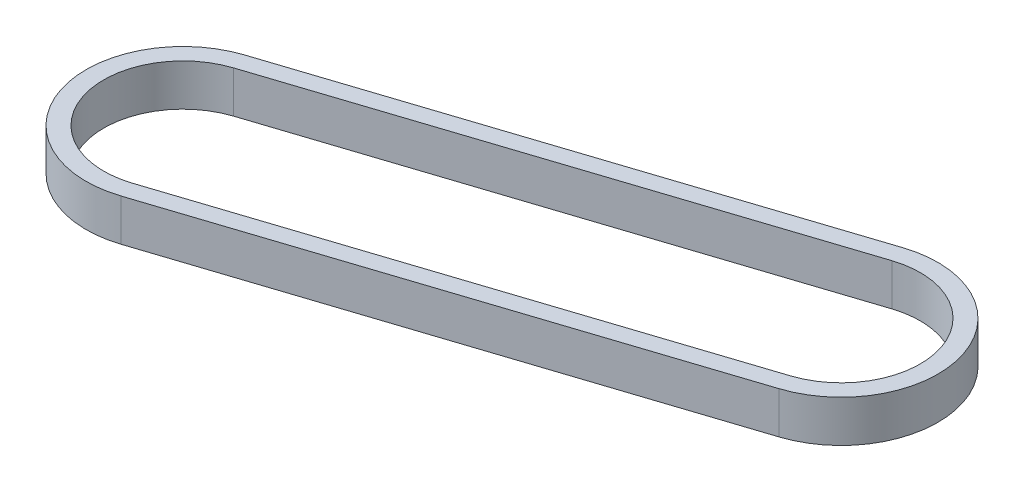
ISO-10303-21;
HEADER;
FILE_DESCRIPTION(('STEP AP214'),'2;1');
FILE_NAME('part.step','',(''),(''),'','','');
FILE_SCHEMA(('AUTOMOTIVE_DESIGN { 1 0 10303 214 1 1 1 1 }'));
ENDSEC;
DATA;
#1=APPLICATION_CONTEXT('core data for automotive mechanical design processes');
#2=APPLICATION_PROTOCOL_DEFINITION('international standard','automotive_design',2000,#1);
#3=PRODUCT_CONTEXT('',#1,'mechanical');
#4=PRODUCT('Part','Part','',(#3));
#5=PRODUCT_RELATED_PRODUCT_CATEGORY('part','',(#4));
#6=PRODUCT_DEFINITION_FORMATION('','',#4);
#7=PRODUCT_DEFINITION_CONTEXT('part definition',#1,'design');
#8=PRODUCT_DEFINITION('design','',#6,#7);
#9=PRODUCT_DEFINITION_SHAPE('','',#8);
#10=(LENGTH_UNIT() NAMED_UNIT(*) SI_UNIT(.MILLI.,.METRE.));
#11=(NAMED_UNIT(*) PLANE_ANGLE_UNIT() SI_UNIT($,.RADIAN.));
#12=(NAMED_UNIT(*) SI_UNIT($,.STERADIAN.) SOLID_ANGLE_UNIT());
#13=UNCERTAINTY_MEASURE_WITH_UNIT(LENGTH_MEASURE(1.E-05),#10,'distance_accuracy_value','');
#14=(GEOMETRIC_REPRESENTATION_CONTEXT(3) GLOBAL_UNCERTAINTY_ASSIGNED_CONTEXT((#13)) GLOBAL_UNIT_ASSIGNED_CONTEXT((#10,
#11,#12)) REPRESENTATION_CONTEXT('',''));
#15=CARTESIAN_POINT('',(0.,0.,0.));
#16=DIRECTION('',(0.,0.,1.));
#17=DIRECTION('',(1.,0.,0.));
#18=AXIS2_PLACEMENT_3D('',#15,#16,#17);
#19=CARTESIAN_POINT('',(-120.65,4.5,220.283627107511));
#20=DIRECTION('',(0.,1.,0.));
#21=DIRECTION('',(0.,0.,1.));
#22=AXIS2_PLACEMENT_3D('',#19,#20,#21);
#23=PLANE('',#22);
#24=CARTESIAN_POINT('',(-120.65,4.5,220.283627107511));
#25=DIRECTION('',(0.,1.,0.));
#26=DIRECTION('',(0.,0.,1.));
#27=AXIS2_PLACEMENT_3D('',#24,#25,#26);
#28=CIRCLE('',#27,20.8385928119739);
#29=CARTESIAN_POINT('',(-114.172884766972,4.5,240.090038408939));
#30=VERTEX_POINT('',#29);
#31=CARTESIAN_POINT('',(-127.127115233028,4.5,200.477215806083));
#32=VERTEX_POINT('',#31);
#33=EDGE_CURVE('E140',#30,#32,#28,.T.);
#34=ORIENTED_EDGE('',*,*,#33,.T.);
#35=DIRECTION('',(-0.950467792146074,0.,0.310823062356976));
#36=VECTOR('',#35,1.);
#37=CARTESIAN_POINT('',(-127.127115233028,4.5,200.477215806083));
#38=LINE('',#37,#36);
#39=CARTESIAN_POINT('',(-233.924491814363,4.5,235.402215806084));
#40=VERTEX_POINT('',#39);
#41=EDGE_CURVE('E143',#32,#40,#38,.T.);
#42=ORIENTED_EDGE('',*,*,#41,.T.);
#43=CARTESIAN_POINT('',(-227.447376581335,4.5,255.208627107511));
#44=DIRECTION('',(0.,1.,0.));
#45=DIRECTION('',(0.,0.,1.));
#46=AXIS2_PLACEMENT_3D('',#43,#44,#45);
#47=CIRCLE('',#46,20.8385928119739);
#48=CARTESIAN_POINT('',(-220.970261348307,4.5,275.015038408939));
#49=VERTEX_POINT('',#48);
#50=EDGE_CURVE('E146',#40,#49,#47,.T.);
#51=ORIENTED_EDGE('',*,*,#50,.T.);
#52=DIRECTION('',(0.950467792146073,0.,-0.310823062356976));
#53=VECTOR('',#52,1.);
#54=CARTESIAN_POINT('',(-114.172884766972,4.5,240.090038408939));
#55=LINE('',#54,#53);
#56=EDGE_CURVE('E148',#49,#30,#55,.T.);
#57=ORIENTED_EDGE('',*,*,#56,.T.);
#58=EDGE_LOOP('',(#34,#42,#51,#57));
#59=FACE_BOUND('',#58,.T.);
#60=DIRECTION('',(-0.950467792146074,0.,0.310823062356976));
#61=VECTOR('',#60,1.);
#62=CARTESIAN_POINT('',(-125.945987596071,4.5,204.088993416238));
#63=LINE('',#62,#61);
#64=CARTESIAN_POINT('',(-125.945987596071,4.5,204.088993416238));
#65=VERTEX_POINT('',#64);
#66=CARTESIAN_POINT('',(-232.743364177406,4.5,239.013993416239));
#67=VERTEX_POINT('',#66);
#68=EDGE_CURVE('E112',#65,#67,#63,.T.);
#69=ORIENTED_EDGE('',*,*,#68,.F.);
#70=CARTESIAN_POINT('',(-120.65,4.5,220.283627107511));
#71=DIRECTION('',(0.,1.,0.));
#72=DIRECTION('',(0.,0.,1.));
#73=AXIS2_PLACEMENT_3D('',#70,#71,#72);
#74=CIRCLE('',#73,17.0385928119739);
#75=CARTESIAN_POINT('',(-115.354012403929,4.5,236.478260798784));
#76=VERTEX_POINT('',#75);
#77=EDGE_CURVE('E104',#76,#65,#74,.T.);
#78=ORIENTED_EDGE('',*,*,#77,.F.);
#79=DIRECTION('',(0.950467792146073,0.,-0.310823062356976));
#80=VECTOR('',#79,1.);
#81=CARTESIAN_POINT('',(-115.354012403929,4.5,236.478260798784));
#82=LINE('',#81,#80);
#83=CARTESIAN_POINT('',(-222.151388985264,4.5,271.403260798784));
#84=VERTEX_POINT('',#83);
#85=EDGE_CURVE('E126',#84,#76,#82,.T.);
#86=ORIENTED_EDGE('',*,*,#85,.F.);
#87=CARTESIAN_POINT('',(-227.447376581335,4.5,255.208627107511));
#88=DIRECTION('',(0.,1.,0.));
#89=DIRECTION('',(0.,0.,1.));
#90=AXIS2_PLACEMENT_3D('',#87,#88,#89);
#91=CIRCLE('',#90,17.0385928119739);
#92=EDGE_CURVE('E124',#67,#84,#91,.T.);
#93=ORIENTED_EDGE('',*,*,#92,.F.);
#94=EDGE_LOOP('',(#69,#78,#86,#93));
#95=FACE_BOUND('',#94,.T.);
#96=ADVANCED_FACE('F39',(#59,#95),#23,.T.);
#97=CARTESIAN_POINT('',(-120.65,-4.5,220.283627107511));
#98=DIRECTION('',(0.,1.,0.));
#99=DIRECTION('',(0.,0.,1.));
#100=AXIS2_PLACEMENT_3D('',#97,#98,#99);
#101=PLANE('',#100);
#102=CARTESIAN_POINT('',(-120.65,-4.5,220.283627107511));
#103=DIRECTION('',(0.,1.,0.));
#104=DIRECTION('',(0.,0.,1.));
#105=AXIS2_PLACEMENT_3D('',#102,#103,#104);
#106=CIRCLE('',#105,20.8385928119739);
#107=CARTESIAN_POINT('',(-114.172884766972,-4.5,240.090038408939));
#108=VERTEX_POINT('',#107);
#109=CARTESIAN_POINT('',(-127.127115233028,-4.5,200.477215806083));
#110=VERTEX_POINT('',#109);
#111=EDGE_CURVE('E120',#108,#110,#106,.T.);
#112=ORIENTED_EDGE('',*,*,#111,.F.);
#113=DIRECTION('',(0.950467792146073,0.,-0.310823062356976));
#114=VECTOR('',#113,1.);
#115=CARTESIAN_POINT('',(-114.172884766972,-4.5,240.090038408939));
#116=LINE('',#115,#114);
#117=CARTESIAN_POINT('',(-220.970261348307,-4.5,275.015038408939));
#118=VERTEX_POINT('',#117);
#119=EDGE_CURVE('E144',#118,#108,#116,.T.);
#120=ORIENTED_EDGE('',*,*,#119,.F.);
#121=CARTESIAN_POINT('',(-227.447376581335,-4.5,255.208627107511));
#122=DIRECTION('',(0.,1.,0.));
#123=DIRECTION('',(0.,0.,1.));
#124=AXIS2_PLACEMENT_3D('',#121,#122,#123);
#125=CIRCLE('',#124,20.8385928119739);
#126=CARTESIAN_POINT('',(-233.924491814363,-4.5,235.402215806084));
#127=VERTEX_POINT('',#126);
#128=EDGE_CURVE('E155',#127,#118,#125,.T.);
#129=ORIENTED_EDGE('',*,*,#128,.F.);
#130=DIRECTION('',(-0.950467792146074,0.,0.310823062356976));
#131=VECTOR('',#130,1.);
#132=CARTESIAN_POINT('',(-127.127115233028,-4.5,200.477215806083));
#133=LINE('',#132,#131);
#134=EDGE_CURVE('E153',#110,#127,#133,.T.);
#135=ORIENTED_EDGE('',*,*,#134,.F.);
#136=EDGE_LOOP('',(#112,#120,#129,#135));
#137=FACE_BOUND('',#136,.T.);
#138=CARTESIAN_POINT('',(-120.65,-4.5,220.283627107511));
#139=DIRECTION('',(0.,1.,0.));
#140=DIRECTION('',(0.,0.,1.));
#141=AXIS2_PLACEMENT_3D('',#138,#139,#140);
#142=CIRCLE('',#141,17.0385928119739);
#143=CARTESIAN_POINT('',(-115.354012403929,-4.5,236.478260798784));
#144=VERTEX_POINT('',#143);
#145=CARTESIAN_POINT('',(-125.945987596071,-4.5,204.088993416238));
#146=VERTEX_POINT('',#145);
#147=EDGE_CURVE('E62',#144,#146,#142,.T.);
#148=ORIENTED_EDGE('',*,*,#147,.T.);
#149=DIRECTION('',(-0.950467792146074,0.,0.310823062356976));
#150=VECTOR('',#149,1.);
#151=CARTESIAN_POINT('',(-125.945987596071,-4.5,204.088993416238));
#152=LINE('',#151,#150);
#153=CARTESIAN_POINT('',(-232.743364177406,-4.5,239.013993416239));
#154=VERTEX_POINT('',#153);
#155=EDGE_CURVE('E119',#146,#154,#152,.T.);
#156=ORIENTED_EDGE('',*,*,#155,.T.);
#157=CARTESIAN_POINT('',(-227.447376581335,-4.5,255.208627107511));
#158=DIRECTION('',(0.,1.,0.));
#159=DIRECTION('',(0.,0.,1.));
#160=AXIS2_PLACEMENT_3D('',#157,#158,#159);
#161=CIRCLE('',#160,17.0385928119739);
#162=CARTESIAN_POINT('',(-222.151388985264,-4.5,271.403260798784));
#163=VERTEX_POINT('',#162);
#164=EDGE_CURVE('E132',#154,#163,#161,.T.);
#165=ORIENTED_EDGE('',*,*,#164,.T.);
#166=DIRECTION('',(0.950467792146073,0.,-0.310823062356976));
#167=VECTOR('',#166,1.);
#168=CARTESIAN_POINT('',(-115.354012403929,-4.5,236.478260798784));
#169=LINE('',#168,#167);
#170=EDGE_CURVE('E113',#163,#144,#169,.T.);
#171=ORIENTED_EDGE('',*,*,#170,.T.);
#172=EDGE_LOOP('',(#148,#156,#165,#171));
#173=FACE_BOUND('',#172,.T.);
#174=ADVANCED_FACE('F173',(#137,#173),#101,.F.);
#175=CARTESIAN_POINT('',(-120.65,4.5,220.283627107511));
#176=DIRECTION('',(0.,-1.,0.));
#177=DIRECTION('',(0.,0.,-1.));
#178=AXIS2_PLACEMENT_3D('',#175,#176,#177);
#179=CYLINDRICAL_SURFACE('',#178,20.8385928119739);
#180=ORIENTED_EDGE('',*,*,#111,.T.);
#181=DIRECTION('',(0.,-1.,0.));
#182=VECTOR('',#181,1.);
#183=CARTESIAN_POINT('',(-127.127115233028,4.5,200.477215806083));
#184=LINE('',#183,#182);
#185=EDGE_CURVE('E11',#32,#110,#184,.T.);
#186=ORIENTED_EDGE('',*,*,#185,.F.);
#187=ORIENTED_EDGE('',*,*,#33,.F.);
#188=DIRECTION('',(0.,-1.,0.));
#189=VECTOR('',#188,1.);
#190=CARTESIAN_POINT('',(-114.172884766972,4.5,240.090038408939));
#191=LINE('',#190,#189);
#192=EDGE_CURVE('E150',#30,#108,#191,.T.);
#193=ORIENTED_EDGE('',*,*,#192,.T.);
#194=EDGE_LOOP('',(#180,#186,#187,#193));
#195=FACE_BOUND('',#194,.T.);
#196=ADVANCED_FACE('F41',(#195),#179,.T.);
#197=CARTESIAN_POINT('',(-127.127115233028,4.5,200.477215806083));
#198=DIRECTION('',(0.310823062356976,0.,0.950467792146073));
#199=DIRECTION('',(0.950467792146073,0.,-0.310823062356976));
#200=AXIS2_PLACEMENT_3D('',#197,#198,#199);
#201=PLANE('',#200);
#202=ORIENTED_EDGE('',*,*,#134,.T.);
#203=DIRECTION('',(0.,-1.,0.));
#204=VECTOR('',#203,1.);
#205=CARTESIAN_POINT('',(-233.924491814363,4.5,235.402215806084));
#206=LINE('',#205,#204);
#207=EDGE_CURVE('E47',#40,#127,#206,.T.);
#208=ORIENTED_EDGE('',*,*,#207,.F.);
#209=ORIENTED_EDGE('',*,*,#41,.F.);
#210=ORIENTED_EDGE('',*,*,#185,.T.);
#211=EDGE_LOOP('',(#202,#208,#209,#210));
#212=FACE_BOUND('',#211,.T.);
#213=ADVANCED_FACE('F183',(#212),#201,.F.);
#214=CARTESIAN_POINT('',(-227.447376581335,4.5,255.208627107511));
#215=DIRECTION('',(0.,-1.,0.));
#216=DIRECTION('',(0.,0.,-1.));
#217=AXIS2_PLACEMENT_3D('',#214,#215,#216);
#218=CYLINDRICAL_SURFACE('',#217,20.8385928119739);
#219=ORIENTED_EDGE('',*,*,#128,.T.);
#220=DIRECTION('',(0.,-1.,0.));
#221=VECTOR('',#220,1.);
#222=CARTESIAN_POINT('',(-220.970261348307,4.5,275.015038408939));
#223=LINE('',#222,#221);
#224=EDGE_CURVE('E160',#49,#118,#223,.T.);
#225=ORIENTED_EDGE('',*,*,#224,.F.);
#226=ORIENTED_EDGE('',*,*,#50,.F.);
#227=ORIENTED_EDGE('',*,*,#207,.T.);
#228=EDGE_LOOP('',(#219,#225,#226,#227));
#229=FACE_BOUND('',#228,.T.);
#230=ADVANCED_FACE('F167',(#229),#218,.T.);
#231=CARTESIAN_POINT('',(-114.172884766972,4.5,240.090038408939));
#232=DIRECTION('',(-0.310823062356976,0.,-0.950467792146073));
#233=DIRECTION('',(-0.950467792146073,0.,0.310823062356976));
#234=AXIS2_PLACEMENT_3D('',#231,#232,#233);
#235=PLANE('',#234);
#236=ORIENTED_EDGE('',*,*,#119,.T.);
#237=ORIENTED_EDGE('',*,*,#192,.F.);
#238=ORIENTED_EDGE('',*,*,#56,.F.);
#239=ORIENTED_EDGE('',*,*,#224,.T.);
#240=EDGE_LOOP('',(#236,#237,#238,#239));
#241=FACE_BOUND('',#240,.T.);
#242=ADVANCED_FACE('F177',(#241),#235,.F.);
#243=CARTESIAN_POINT('',(-120.65,4.5,220.283627107511));
#244=DIRECTION('',(0.,-1.,0.));
#245=DIRECTION('',(0.,0.,-1.));
#246=AXIS2_PLACEMENT_3D('',#243,#244,#245);
#247=CYLINDRICAL_SURFACE('',#246,17.0385928119739);
#248=ORIENTED_EDGE('',*,*,#147,.F.);
#249=DIRECTION('',(0.,-1.,0.));
#250=VECTOR('',#249,1.);
#251=CARTESIAN_POINT('',(-115.354012403929,4.5,236.478260798784));
#252=LINE('',#251,#250);
#253=EDGE_CURVE('E108',#76,#144,#252,.T.);
#254=ORIENTED_EDGE('',*,*,#253,.F.);
#255=ORIENTED_EDGE('',*,*,#77,.T.);
#256=DIRECTION('',(0.,-1.,0.));
#257=VECTOR('',#256,1.);
#258=CARTESIAN_POINT('',(-125.945987596071,4.5,204.088993416238));
#259=LINE('',#258,#257);
#260=EDGE_CURVE('E107',#65,#146,#259,.T.);
#261=ORIENTED_EDGE('',*,*,#260,.T.);
#262=EDGE_LOOP('',(#248,#254,#255,#261));
#263=FACE_BOUND('',#262,.T.);
#264=ADVANCED_FACE('F106',(#263),#247,.F.);
#265=CARTESIAN_POINT('',(-125.945987596071,4.5,204.088993416238));
#266=DIRECTION('',(0.310823062356976,0.,0.950467792146073));
#267=DIRECTION('',(0.950467792146073,0.,-0.310823062356976));
#268=AXIS2_PLACEMENT_3D('',#265,#266,#267);
#269=PLANE('',#268);
#270=ORIENTED_EDGE('',*,*,#155,.F.);
#271=ORIENTED_EDGE('',*,*,#260,.F.);
#272=ORIENTED_EDGE('',*,*,#68,.T.);
#273=DIRECTION('',(0.,-1.,0.));
#274=VECTOR('',#273,1.);
#275=CARTESIAN_POINT('',(-232.743364177406,4.5,239.013993416239));
#276=LINE('',#275,#274);
#277=EDGE_CURVE('E121',#67,#154,#276,.T.);
#278=ORIENTED_EDGE('',*,*,#277,.T.);
#279=EDGE_LOOP('',(#270,#271,#272,#278));
#280=FACE_BOUND('',#279,.T.);
#281=ADVANCED_FACE('F116',(#280),#269,.T.);
#282=CARTESIAN_POINT('',(-227.447376581335,4.5,255.208627107511));
#283=DIRECTION('',(0.,-1.,0.));
#284=DIRECTION('',(0.,0.,-1.));
#285=AXIS2_PLACEMENT_3D('',#282,#283,#284);
#286=CYLINDRICAL_SURFACE('',#285,17.0385928119739);
#287=ORIENTED_EDGE('',*,*,#164,.F.);
#288=ORIENTED_EDGE('',*,*,#277,.F.);
#289=ORIENTED_EDGE('',*,*,#92,.T.);
#290=DIRECTION('',(0.,-1.,0.));
#291=VECTOR('',#290,1.);
#292=CARTESIAN_POINT('',(-222.151388985264,4.5,271.403260798784));
#293=LINE('',#292,#291);
#294=EDGE_CURVE('E54',#84,#163,#293,.T.);
#295=ORIENTED_EDGE('',*,*,#294,.T.);
#296=EDGE_LOOP('',(#287,#288,#289,#295));
#297=FACE_BOUND('',#296,.T.);
#298=ADVANCED_FACE('F206',(#297),#286,.F.);
#299=CARTESIAN_POINT('',(-115.354012403929,4.5,236.478260798784));
#300=DIRECTION('',(-0.310823062356976,0.,-0.950467792146073));
#301=DIRECTION('',(-0.950467792146073,0.,0.310823062356976));
#302=AXIS2_PLACEMENT_3D('',#299,#300,#301);
#303=PLANE('',#302);
#304=ORIENTED_EDGE('',*,*,#170,.F.);
#305=ORIENTED_EDGE('',*,*,#294,.F.);
#306=ORIENTED_EDGE('',*,*,#85,.T.);
#307=ORIENTED_EDGE('',*,*,#253,.T.);
#308=EDGE_LOOP('',(#304,#305,#306,#307));
#309=FACE_BOUND('',#308,.T.);
#310=ADVANCED_FACE('F210',(#309),#303,.T.);
#311=CLOSED_SHELL('',(#96,#174,#196,#213,#230,#242,#264,#281,#298,#310));
#312=MANIFOLD_SOLID_BREP('B2',#311);
#313=ADVANCED_BREP_SHAPE_REPRESENTATION('',(#18,#312),#14);
#314=SHAPE_DEFINITION_REPRESENTATION(#9,#313);
ENDSEC;
END-ISO-10303-21;
